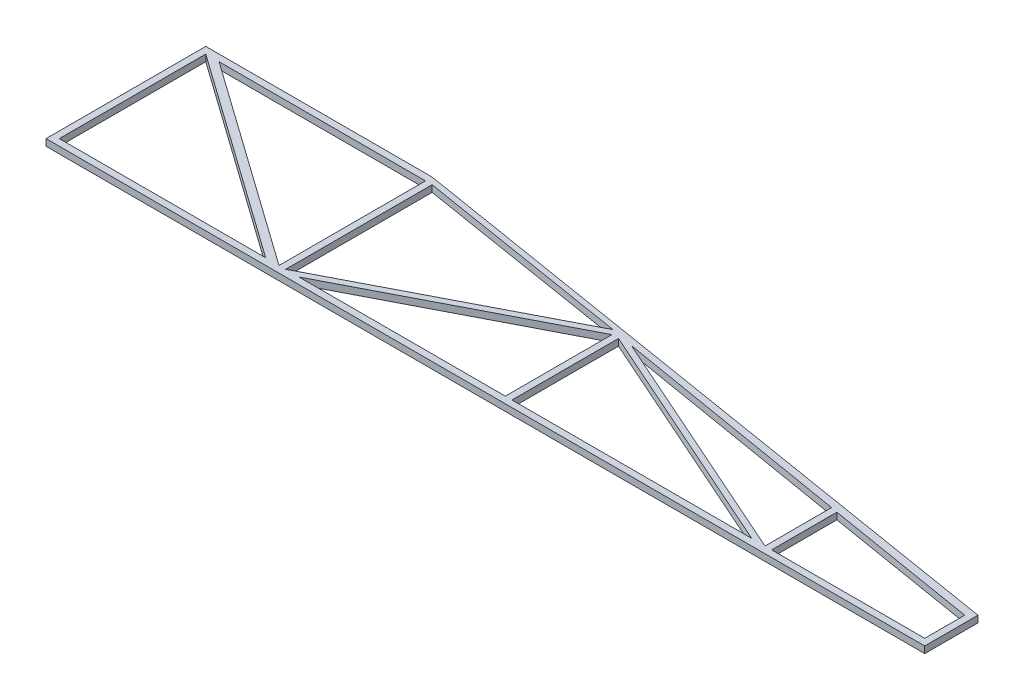
ISO-10303-21;
HEADER;
FILE_DESCRIPTION(('STEP AP214'),'2;1');
FILE_NAME('part.step','',(''),(''),'','','');
FILE_SCHEMA(('AUTOMOTIVE_DESIGN { 1 0 10303 214 1 1 1 1 }'));
ENDSEC;
DATA;
#1=APPLICATION_CONTEXT('core data for automotive mechanical design processes');
#2=APPLICATION_PROTOCOL_DEFINITION('international standard','automotive_design',2000,#1);
#3=PRODUCT_CONTEXT('',#1,'mechanical');
#4=PRODUCT('Part','Part','',(#3));
#5=PRODUCT_RELATED_PRODUCT_CATEGORY('part','',(#4));
#6=PRODUCT_DEFINITION_FORMATION('','',#4);
#7=PRODUCT_DEFINITION_CONTEXT('part definition',#1,'design');
#8=PRODUCT_DEFINITION('design','',#6,#7);
#9=PRODUCT_DEFINITION_SHAPE('','',#8);
#10=(LENGTH_UNIT() NAMED_UNIT(*) SI_UNIT(.MILLI.,.METRE.));
#11=(NAMED_UNIT(*) PLANE_ANGLE_UNIT() SI_UNIT($,.RADIAN.));
#12=(NAMED_UNIT(*) SI_UNIT($,.STERADIAN.) SOLID_ANGLE_UNIT());
#13=UNCERTAINTY_MEASURE_WITH_UNIT(LENGTH_MEASURE(1.E-05),#10,'distance_accuracy_value','');
#14=(GEOMETRIC_REPRESENTATION_CONTEXT(3) GLOBAL_UNCERTAINTY_ASSIGNED_CONTEXT((#13)) GLOBAL_UNIT_ASSIGNED_CONTEXT((#10,
#11,#12)) REPRESENTATION_CONTEXT('',''));
#15=CARTESIAN_POINT('',(0.,0.,0.));
#16=DIRECTION('',(0.,0.,1.));
#17=DIRECTION('',(1.,0.,0.));
#18=AXIS2_PLACEMENT_3D('',#15,#16,#17);
#19=CARTESIAN_POINT('',(0.,-6.35,0.));
#20=DIRECTION('',(0.,-1.,0.));
#21=DIRECTION('',(0.,0.,-1.));
#22=AXIS2_PLACEMENT_3D('',#19,#20,#21);
#23=PLANE('',#22);
#24=DIRECTION('',(-1.,0.,0.));
#25=VECTOR('',#24,1.);
#26=CARTESIAN_POINT('',(603.206446509024,-6.35,75.7404065649321));
#27=LINE('',#26,#25);
#28=CARTESIAN_POINT('',(749.256446509024,-6.35,75.7404065649321));
#29=VERTEX_POINT('',#28);
#30=CARTESIAN_POINT('',(603.206446509024,-6.35,75.7404065649321));
#31=VERTEX_POINT('',#30);
#32=EDGE_CURVE('E214',#29,#31,#27,.T.);
#33=ORIENTED_EDGE('',*,*,#32,.F.);
#34=DIRECTION('',(0.,0.,1.));
#35=VECTOR('',#34,1.);
#36=CARTESIAN_POINT('',(749.256446509024,-6.35,75.7404065649321));
#37=LINE('',#36,#35);
#38=CARTESIAN_POINT('',(749.256446509023,-6.35,37.6404065649321));
#39=VERTEX_POINT('',#38);
#40=EDGE_CURVE('E226',#39,#29,#37,.T.);
#41=ORIENTED_EDGE('',*,*,#40,.F.);
#42=DIRECTION('',(0.986624816923063,0.,0.163007578448159));
#43=VECTOR('',#42,1.);
#44=CARTESIAN_POINT('',(603.206446509024,-6.35,13.5104065649321));
#45=LINE('',#44,#43);
#46=CARTESIAN_POINT('',(603.206446509024,-6.35,13.5104065649321));
#47=VERTEX_POINT('',#46);
#48=EDGE_CURVE('E31',#47,#39,#45,.T.);
#49=ORIENTED_EDGE('',*,*,#48,.F.);
#50=DIRECTION('',(0.,0.,-1.));
#51=VECTOR('',#50,1.);
#52=CARTESIAN_POINT('',(603.206446509024,-6.35,75.7404065649321));
#53=LINE('',#52,#51);
#54=EDGE_CURVE('E207',#31,#47,#53,.T.);
#55=ORIENTED_EDGE('',*,*,#54,.F.);
#56=EDGE_LOOP('',(#33,#41,#49,#55));
#57=FACE_BOUND('',#56,.T.);
#58=DIRECTION('',(0.,0.,-1.));
#59=VECTOR('',#58,1.);
#60=CARTESIAN_POINT('',(133.306446509024,-6.35,75.7404065649321));
#61=LINE('',#60,#59);
#62=CARTESIAN_POINT('',(133.306446509024,-6.35,75.7404065649321));
#63=VERTEX_POINT('',#62);
#64=CARTESIAN_POINT('',(133.306446509024,-6.35,-63.9595934350679));
#65=VERTEX_POINT('',#64);
#66=EDGE_CURVE('E312',#63,#65,#61,.T.);
#67=ORIENTED_EDGE('',*,*,#66,.T.);
#68=DIRECTION('',(-1.,0.,0.));
#69=VECTOR('',#68,1.);
#70=CARTESIAN_POINT('',(133.306446509024,-6.35,-63.9595934350679));
#71=LINE('',#70,#69);
#72=CARTESIAN_POINT('',(-63.5435534909765,-6.35,-63.9595934350679));
#73=VERTEX_POINT('',#72);
#74=EDGE_CURVE('E307',#65,#73,#71,.T.);
#75=ORIENTED_EDGE('',*,*,#74,.T.);
#76=DIRECTION('',(0.815507144735217,0.,0.578747005941122));
#77=VECTOR('',#76,1.);
#78=CARTESIAN_POINT('',(-63.5435534909765,-6.35,-63.9595934350679));
#79=LINE('',#78,#77);
#80=EDGE_CURVE('E308',#73,#63,#79,.T.);
#81=ORIENTED_EDGE('',*,*,#80,.T.);
#82=EDGE_LOOP('',(#67,#75,#81));
#83=FACE_BOUND('',#82,.T.);
#84=DIRECTION('',(1.,0.,0.));
#85=VECTOR('',#84,1.);
#86=CARTESIAN_POINT('',(-82.5935534909764,-6.35,-70.3095934350679));
#87=LINE('',#86,#85);
#88=CARTESIAN_POINT('',(-82.5935534909764,-6.35,-70.3095934350679));
#89=VERTEX_POINT('',#88);
#90=CARTESIAN_POINT('',(131.246613350232,-6.35,-70.3095934350679));
#91=VERTEX_POINT('',#90);
#92=EDGE_CURVE('E346',#89,#91,#87,.T.);
#93=ORIENTED_EDGE('',*,*,#92,.T.);
#94=CARTESIAN_POINT('',(131.246613350232,-6.35,-44.9095934350679));
#95=DIRECTION('',(0.,-1.,0.));
#96=DIRECTION('',(0.,0.,-1.));
#97=AXIS2_PLACEMENT_3D('',#94,#95,#96);
#98=CIRCLE('',#97,25.4);
#99=CARTESIAN_POINT('',(135.339363582347,-6.35,-69.9776886067702));
#100=VERTEX_POINT('',#99);
#101=EDGE_CURVE('E393',#91,#100,#98,.T.);
#102=ORIENTED_EDGE('',*,*,#101,.T.);
#103=DIRECTION('',(0.986932880775682,0.,0.161131898902152));
#104=VECTOR('',#103,1.);
#105=CARTESIAN_POINT('',(133.306446509024,-6.35,-70.3095934350679));
#106=LINE('',#105,#104);
#107=CARTESIAN_POINT('',(755.606446509024,-6.35,31.2904065649321));
#108=VERTEX_POINT('',#107);
#109=EDGE_CURVE('E349',#100,#108,#106,.T.);
#110=ORIENTED_EDGE('',*,*,#109,.T.);
#111=DIRECTION('',(0.,0.,1.));
#112=VECTOR('',#111,1.);
#113=CARTESIAN_POINT('',(755.606446509023,-6.35,82.0904065649321));
#114=LINE('',#113,#112);
#115=CARTESIAN_POINT('',(755.606446509023,-6.35,82.0904065649321));
#116=VERTEX_POINT('',#115);
#117=EDGE_CURVE('E352',#108,#116,#114,.T.);
#118=ORIENTED_EDGE('',*,*,#117,.T.);
#119=DIRECTION('',(-1.,0.,0.));
#120=VECTOR('',#119,1.);
#121=CARTESIAN_POINT('',(-82.5935534909764,-6.35,82.0904065649321));
#122=LINE('',#121,#120);
#123=CARTESIAN_POINT('',(-82.5935534909764,-6.35,82.0904065649321));
#124=VERTEX_POINT('',#123);
#125=EDGE_CURVE('E354',#116,#124,#122,.T.);
#126=ORIENTED_EDGE('',*,*,#125,.T.);
#127=DIRECTION('',(0.,0.,-1.));
#128=VECTOR('',#127,1.);
#129=CARTESIAN_POINT('',(-82.5935534909764,-6.35,82.0904065649321));
#130=LINE('',#129,#128);
#131=EDGE_CURVE('E350',#124,#89,#130,.T.);
#132=ORIENTED_EDGE('',*,*,#131,.T.);
#133=EDGE_LOOP('',(#93,#102,#110,#118,#126,#132));
#134=FACE_BOUND('',#133,.T.);
#135=DIRECTION('',(0.,0.,1.));
#136=VECTOR('',#135,1.);
#137=CARTESIAN_POINT('',(-76.2435534909764,-6.35,75.7404065649321));
#138=LINE('',#137,#136);
#139=CARTESIAN_POINT('',(-76.2435534909764,-6.35,-63.9595934350679));
#140=VERTEX_POINT('',#139);
#141=CARTESIAN_POINT('',(-76.2435534909764,-6.35,75.7404065649321));
#142=VERTEX_POINT('',#141);
#143=EDGE_CURVE('E331',#140,#142,#138,.T.);
#144=ORIENTED_EDGE('',*,*,#143,.T.);
#145=DIRECTION('',(1.,0.,0.));
#146=VECTOR('',#145,1.);
#147=CARTESIAN_POINT('',(-76.2435534909764,-6.35,75.7404065649321));
#148=LINE('',#147,#146);
#149=CARTESIAN_POINT('',(120.606446509024,-6.35,75.7404065649321));
#150=VERTEX_POINT('',#149);
#151=EDGE_CURVE('E326',#142,#150,#148,.T.);
#152=ORIENTED_EDGE('',*,*,#151,.T.);
#153=DIRECTION('',(-0.815507144735217,0.,-0.578747005941122));
#154=VECTOR('',#153,1.);
#155=CARTESIAN_POINT('',(120.606446509024,-6.35,75.7404065649321));
#156=LINE('',#155,#154);
#157=EDGE_CURVE('E327',#150,#140,#156,.T.);
#158=ORIENTED_EDGE('',*,*,#157,.T.);
#159=EDGE_LOOP('',(#144,#152,#158));
#160=FACE_BOUND('',#159,.T.);
#161=DIRECTION('',(-0.888617232654949,0.,0.458649554484314));
#162=VECTOR('',#161,1.);
#163=CARTESIAN_POINT('',(139.656446509024,-6.35,75.7404065649321));
#164=LINE('',#163,#162);
#165=CARTESIAN_POINT('',(345.615705607624,-6.35,-30.5630939256699));
#166=VERTEX_POINT('',#165);
#167=CARTESIAN_POINT('',(139.656446509024,-6.35,75.7404065649321));
#168=VERTEX_POINT('',#167);
#169=EDGE_CURVE('E289',#166,#168,#164,.T.);
#170=ORIENTED_EDGE('',*,*,#169,.F.);
#171=DIRECTION('',(0.987107218888045,0.,0.160060421151232));
#172=VECTOR('',#171,1.);
#173=CARTESIAN_POINT('',(139.656446509024,-6.35,-63.9595934350679));
#174=LINE('',#173,#172);
#175=CARTESIAN_POINT('',(139.656446509024,-6.35,-63.9595934350679));
#176=VERTEX_POINT('',#175);
#177=EDGE_CURVE('E293',#176,#166,#174,.T.);
#178=ORIENTED_EDGE('',*,*,#177,.F.);
#179=DIRECTION('',(0.,0.,-1.));
#180=VECTOR('',#179,1.);
#181=CARTESIAN_POINT('',(139.656446509024,-6.35,75.7404065649321));
#182=LINE('',#181,#180);
#183=EDGE_CURVE('E290',#168,#176,#182,.T.);
#184=ORIENTED_EDGE('',*,*,#183,.F.);
#185=EDGE_LOOP('',(#170,#178,#184));
#186=FACE_BOUND('',#185,.T.);
#187=DIRECTION('',(0.,0.,1.));
#188=VECTOR('',#187,1.);
#189=CARTESIAN_POINT('',(349.206446509024,-6.35,75.7404065649321));
#190=LINE('',#189,#188);
#191=CARTESIAN_POINT('',(349.206446509024,-6.35,-25.8595934350679));
#192=VERTEX_POINT('',#191);
#193=CARTESIAN_POINT('',(349.206446509024,-6.35,75.7404065649321));
#194=VERTEX_POINT('',#193);
#195=EDGE_CURVE('E271',#192,#194,#190,.T.);
#196=ORIENTED_EDGE('',*,*,#195,.F.);
#197=DIRECTION('',(0.888620657054864,0.,-0.458642919770252));
#198=VECTOR('',#197,1.);
#199=CARTESIAN_POINT('',(152.356446509024,-6.35,75.7404065649321));
#200=LINE('',#199,#198);
#201=CARTESIAN_POINT('',(152.356446509024,-6.35,75.7404065649321));
#202=VERTEX_POINT('',#201);
#203=EDGE_CURVE('E275',#202,#192,#200,.T.);
#204=ORIENTED_EDGE('',*,*,#203,.F.);
#205=DIRECTION('',(-1.,0.,0.));
#206=VECTOR('',#205,1.);
#207=CARTESIAN_POINT('',(349.206446509024,-6.35,75.7404065649321));
#208=LINE('',#207,#206);
#209=EDGE_CURVE('E272',#194,#202,#208,.T.);
#210=ORIENTED_EDGE('',*,*,#209,.F.);
#211=EDGE_LOOP('',(#196,#204,#210));
#212=FACE_BOUND('',#211,.T.);
#213=DIRECTION('',(0.,0.,1.));
#214=VECTOR('',#213,1.);
#215=CARTESIAN_POINT('',(596.856446509024,-6.35,75.7404065649321));
#216=LINE('',#215,#214);
#217=CARTESIAN_POINT('',(596.856446509024,-6.35,12.2520352918808));
#218=VERTEX_POINT('',#217);
#219=CARTESIAN_POINT('',(596.856446509024,-6.35,75.7404065649321));
#220=VERTEX_POINT('',#219);
#221=EDGE_CURVE('E253',#218,#220,#216,.T.);
#222=ORIENTED_EDGE('',*,*,#221,.F.);
#223=DIRECTION('',(0.986275407418878,0.,0.165108511957215));
#224=VECTOR('',#223,1.);
#225=CARTESIAN_POINT('',(367.645239742049,-6.35,-26.1193171605279));
#226=LINE('',#225,#224);
#227=CARTESIAN_POINT('',(367.645239742049,-6.35,-26.1193171605279));
#228=VERTEX_POINT('',#227);
#229=EDGE_CURVE('E257',#228,#218,#226,.T.);
#230=ORIENTED_EDGE('',*,*,#229,.F.);
#231=DIRECTION('',(-0.913829190738463,0.,-0.406098768964258));
#232=VECTOR('',#231,1.);
#233=CARTESIAN_POINT('',(596.856446509024,-6.35,75.7404065649321));
#234=LINE('',#233,#232);
#235=EDGE_CURVE('E254',#220,#228,#234,.T.);
#236=ORIENTED_EDGE('',*,*,#235,.F.);
#237=EDGE_LOOP('',(#222,#230,#236));
#238=FACE_BOUND('',#237,.T.);
#239=DIRECTION('',(0.,0.,1.));
#240=VECTOR('',#239,1.);
#241=CARTESIAN_POINT('',(355.556446509024,-6.35,75.7404065649321));
#242=LINE('',#241,#240);
#243=CARTESIAN_POINT('',(355.556446509024,-6.35,-25.859593435068));
#244=VERTEX_POINT('',#243);
#245=CARTESIAN_POINT('',(355.556446509024,-6.35,75.7404065649321));
#246=VERTEX_POINT('',#245);
#247=EDGE_CURVE('E239',#244,#246,#242,.T.);
#248=ORIENTED_EDGE('',*,*,#247,.T.);
#249=DIRECTION('',(1.,0.,0.));
#250=VECTOR('',#249,1.);
#251=CARTESIAN_POINT('',(355.556446509024,-6.35,75.7404065649321));
#252=LINE('',#251,#250);
#253=CARTESIAN_POINT('',(584.156446509024,-6.35,75.7404065649321));
#254=VERTEX_POINT('',#253);
#255=EDGE_CURVE('E210',#246,#254,#252,.T.);
#256=ORIENTED_EDGE('',*,*,#255,.T.);
#257=DIRECTION('',(-0.913811548620257,0.,-0.406138466053448));
#258=VECTOR('',#257,1.);
#259=CARTESIAN_POINT('',(584.156446509024,-6.35,75.7404065649321));
#260=LINE('',#259,#258);
#261=EDGE_CURVE('E235',#254,#244,#260,.T.);
#262=ORIENTED_EDGE('',*,*,#261,.T.);
#263=EDGE_LOOP('',(#248,#256,#262));
#264=FACE_BOUND('',#263,.T.);
#265=ADVANCED_FACE('F16',(#57,#83,#134,#160,#186,#212,#238,#264),#23,.T.);
#266=CARTESIAN_POINT('',(0.,0.,0.));
#267=DIRECTION('',(0.,-1.,0.));
#268=DIRECTION('',(0.,0.,-1.));
#269=AXIS2_PLACEMENT_3D('',#266,#267,#268);
#270=PLANE('',#269);
#271=DIRECTION('',(0.,0.,1.));
#272=VECTOR('',#271,1.);
#273=CARTESIAN_POINT('',(749.256446509023,0.,-2.18331170147807E-12));
#274=LINE('',#273,#272);
#275=CARTESIAN_POINT('',(749.256446509023,0.,37.6404065649321));
#276=VERTEX_POINT('',#275);
#277=CARTESIAN_POINT('',(749.256446509024,0.,75.7404065649321));
#278=VERTEX_POINT('',#277);
#279=EDGE_CURVE('E443',#276,#278,#274,.T.);
#280=ORIENTED_EDGE('',*,*,#279,.T.);
#281=DIRECTION('',(-1.,0.,0.));
#282=VECTOR('',#281,1.);
#283=CARTESIAN_POINT('',(0.,0.,75.740406564932));
#284=LINE('',#283,#282);
#285=CARTESIAN_POINT('',(603.206446509024,0.,75.7404065649321));
#286=VERTEX_POINT('',#285);
#287=EDGE_CURVE('E10',#278,#286,#284,.T.);
#288=ORIENTED_EDGE('',*,*,#287,.T.);
#289=DIRECTION('',(0.,0.,-1.));
#290=VECTOR('',#289,1.);
#291=CARTESIAN_POINT('',(603.206446509024,0.,0.));
#292=LINE('',#291,#290);
#293=CARTESIAN_POINT('',(603.206446509024,0.,13.5104065649321));
#294=VERTEX_POINT('',#293);
#295=EDGE_CURVE('E24',#286,#294,#292,.T.);
#296=ORIENTED_EDGE('',*,*,#295,.T.);
#297=DIRECTION('',(0.986624816923063,0.,0.163007578448159));
#298=VECTOR('',#297,1.);
#299=CARTESIAN_POINT('',(13.8552398679068,0.,-83.8606623583831));
#300=LINE('',#299,#298);
#301=EDGE_CURVE('E446',#294,#276,#300,.T.);
#302=ORIENTED_EDGE('',*,*,#301,.T.);
#303=EDGE_LOOP('',(#280,#288,#296,#302));
#304=FACE_BOUND('',#303,.T.);
#305=DIRECTION('',(-1.,0.,0.));
#306=VECTOR('',#305,1.);
#307=CARTESIAN_POINT('',(0.,0.,-63.9595934350679));
#308=LINE('',#307,#306);
#309=CARTESIAN_POINT('',(133.306446509024,0.,-63.9595934350679));
#310=VERTEX_POINT('',#309);
#311=CARTESIAN_POINT('',(-63.5435534909765,0.,-63.9595934350679));
#312=VERTEX_POINT('',#311);
#313=EDGE_CURVE('E407',#310,#312,#308,.T.);
#314=ORIENTED_EDGE('',*,*,#313,.F.);
#315=DIRECTION('',(0.,0.,-1.));
#316=VECTOR('',#315,1.);
#317=CARTESIAN_POINT('',(133.306446509024,0.,0.));
#318=LINE('',#317,#316);
#319=CARTESIAN_POINT('',(133.306446509024,0.,75.7404065649321));
#320=VERTEX_POINT('',#319);
#321=EDGE_CURVE('E402',#320,#310,#318,.T.);
#322=ORIENTED_EDGE('',*,*,#321,.F.);
#323=DIRECTION('',(0.815507144735218,0.,0.578747005941122));
#324=VECTOR('',#323,1.);
#325=CARTESIAN_POINT('',(8.90336528241088,0.,-12.5456510797608));
#326=LINE('',#325,#324);
#327=EDGE_CURVE('E404',#312,#320,#326,.T.);
#328=ORIENTED_EDGE('',*,*,#327,.F.);
#329=EDGE_LOOP('',(#314,#322,#328));
#330=FACE_BOUND('',#329,.T.);
#331=DIRECTION('',(0.986932880775682,0.,0.161131898902152));
#332=VECTOR('',#331,1.);
#333=CARTESIAN_POINT('',(133.306446509024,0.,-70.3095934350679));
#334=LINE('',#333,#332);
#335=CARTESIAN_POINT('',(135.339363582347,0.,-69.9776886067702));
#336=VERTEX_POINT('',#335);
#337=CARTESIAN_POINT('',(755.606446509024,0.,31.2904065649321));
#338=VERTEX_POINT('',#337);
#339=EDGE_CURVE('E364',#336,#338,#334,.T.);
#340=ORIENTED_EDGE('',*,*,#339,.F.);
#341=CARTESIAN_POINT('',(131.246613350232,0.,-44.9095934350679));
#342=DIRECTION('',(0.,-1.,0.));
#343=DIRECTION('',(0.,0.,-1.));
#344=AXIS2_PLACEMENT_3D('',#341,#342,#343);
#345=CIRCLE('',#344,25.4);
#346=CARTESIAN_POINT('',(131.246613350232,0.,-70.3095934350679));
#347=VERTEX_POINT('',#346);
#348=EDGE_CURVE('E389',#336,#347,#345,.F.);
#349=ORIENTED_EDGE('',*,*,#348,.T.);
#350=DIRECTION('',(1.,0.,0.));
#351=VECTOR('',#350,1.);
#352=CARTESIAN_POINT('',(-82.5935534909764,0.,-70.3095934350679));
#353=LINE('',#352,#351);
#354=CARTESIAN_POINT('',(-82.5935534909764,0.,-70.3095934350679));
#355=VERTEX_POINT('',#354);
#356=EDGE_CURVE('E360',#355,#347,#353,.T.);
#357=ORIENTED_EDGE('',*,*,#356,.F.);
#358=DIRECTION('',(0.,0.,-1.));
#359=VECTOR('',#358,1.);
#360=CARTESIAN_POINT('',(-82.5935534909764,0.,82.0904065649321));
#361=LINE('',#360,#359);
#362=CARTESIAN_POINT('',(-82.5935534909764,0.,82.0904065649321));
#363=VERTEX_POINT('',#362);
#364=EDGE_CURVE('E345',#363,#355,#361,.T.);
#365=ORIENTED_EDGE('',*,*,#364,.F.);
#366=DIRECTION('',(-1.,0.,0.));
#367=VECTOR('',#366,1.);
#368=CARTESIAN_POINT('',(-82.5935534909764,0.,82.0904065649321));
#369=LINE('',#368,#367);
#370=CARTESIAN_POINT('',(755.606446509023,0.,82.0904065649321));
#371=VERTEX_POINT('',#370);
#372=EDGE_CURVE('E359',#371,#363,#369,.T.);
#373=ORIENTED_EDGE('',*,*,#372,.F.);
#374=DIRECTION('',(0.,0.,1.));
#375=VECTOR('',#374,1.);
#376=CARTESIAN_POINT('',(755.606446509023,0.,82.0904065649321));
#377=LINE('',#376,#375);
#378=EDGE_CURVE('E367',#338,#371,#377,.T.);
#379=ORIENTED_EDGE('',*,*,#378,.F.);
#380=EDGE_LOOP('',(#340,#349,#357,#365,#373,#379));
#381=FACE_BOUND('',#380,.T.);
#382=DIRECTION('',(1.,0.,0.));
#383=VECTOR('',#382,1.);
#384=CARTESIAN_POINT('',(0.,0.,75.7404065649321));
#385=LINE('',#384,#383);
#386=CARTESIAN_POINT('',(-76.2435534909764,0.,75.7404065649321));
#387=VERTEX_POINT('',#386);
#388=CARTESIAN_POINT('',(120.606446509024,0.,75.7404065649321));
#389=VERTEX_POINT('',#388);
#390=EDGE_CURVE('E400',#387,#389,#385,.T.);
#391=ORIENTED_EDGE('',*,*,#390,.F.);
#392=DIRECTION('',(0.,0.,1.));
#393=VECTOR('',#392,1.);
#394=CARTESIAN_POINT('',(-76.2435534909764,0.,0.));
#395=LINE('',#394,#393);
#396=CARTESIAN_POINT('',(-76.2435534909764,0.,-63.9595934350679));
#397=VERTEX_POINT('',#396);
#398=EDGE_CURVE('E395',#397,#387,#395,.T.);
#399=ORIENTED_EDGE('',*,*,#398,.F.);
#400=DIRECTION('',(-0.815507144735218,0.,-0.578747005941122));
#401=VECTOR('',#400,1.);
#402=CARTESIAN_POINT('',(4.64952445196105,0.,-6.55160263685421));
#403=LINE('',#402,#401);
#404=EDGE_CURVE('E397',#389,#397,#403,.T.);
#405=ORIENTED_EDGE('',*,*,#404,.F.);
#406=EDGE_LOOP('',(#391,#399,#405));
#407=FACE_BOUND('',#406,.T.);
#408=DIRECTION('',(0.987107218888045,0.,0.160060421151232));
#409=VECTOR('',#408,1.);
#410=CARTESIAN_POINT('',(13.6833166769859,0.,-84.386262219203));
#411=LINE('',#410,#409);
#412=CARTESIAN_POINT('',(139.656446509024,0.,-63.9595934350679));
#413=VERTEX_POINT('',#412);
#414=CARTESIAN_POINT('',(345.615705607624,0.,-30.5630939256699));
#415=VERTEX_POINT('',#414);
#416=EDGE_CURVE('E409',#413,#415,#411,.T.);
#417=ORIENTED_EDGE('',*,*,#416,.T.);
#418=DIRECTION('',(-0.888617232654949,0.,0.458649554484314));
#419=VECTOR('',#418,1.);
#420=CARTESIAN_POINT('',(60.2471035504606,0.,116.72662473788));
#421=LINE('',#420,#419);
#422=CARTESIAN_POINT('',(139.656446509024,0.,75.7404065649321));
#423=VERTEX_POINT('',#422);
#424=EDGE_CURVE('E415',#415,#423,#421,.T.);
#425=ORIENTED_EDGE('',*,*,#424,.T.);
#426=DIRECTION('',(0.,0.,-1.));
#427=VECTOR('',#426,1.);
#428=CARTESIAN_POINT('',(139.656446509024,0.,0.));
#429=LINE('',#428,#427);
#430=EDGE_CURVE('E412',#423,#413,#429,.T.);
#431=ORIENTED_EDGE('',*,*,#430,.T.);
#432=EDGE_LOOP('',(#417,#425,#431));
#433=FACE_BOUND('',#432,.T.);
#434=DIRECTION('',(0.888620657054864,0.,-0.458642919770252));
#435=VECTOR('',#434,1.);
#436=CARTESIAN_POINT('',(62.9174132806214,0.,121.902488231204));
#437=LINE('',#436,#435);
#438=CARTESIAN_POINT('',(152.356446509024,0.,75.7404065649321));
#439=VERTEX_POINT('',#438);
#440=CARTESIAN_POINT('',(349.206446509024,0.,-25.8595934350679));
#441=VERTEX_POINT('',#440);
#442=EDGE_CURVE('E418',#439,#441,#437,.T.);
#443=ORIENTED_EDGE('',*,*,#442,.T.);
#444=DIRECTION('',(0.,0.,1.));
#445=VECTOR('',#444,1.);
#446=CARTESIAN_POINT('',(349.206446509024,0.,0.));
#447=LINE('',#446,#445);
#448=CARTESIAN_POINT('',(349.206446509024,0.,75.7404065649321));
#449=VERTEX_POINT('',#448);
#450=EDGE_CURVE('E424',#441,#449,#447,.T.);
#451=ORIENTED_EDGE('',*,*,#450,.T.);
#452=DIRECTION('',(-1.,0.,0.));
#453=VECTOR('',#452,1.);
#454=CARTESIAN_POINT('',(0.,0.,75.740406564932));
#455=LINE('',#454,#453);
#456=EDGE_CURVE('E421',#449,#439,#455,.T.);
#457=ORIENTED_EDGE('',*,*,#456,.T.);
#458=EDGE_LOOP('',(#443,#451,#457));
#459=FACE_BOUND('',#458,.T.);
#460=DIRECTION('',(0.986275407418878,0.,0.165108511957215));
#461=VECTOR('',#460,1.);
#462=CARTESIAN_POINT('',(14.2756449573335,0.,-85.2755401860192));
#463=LINE('',#462,#461);
#464=CARTESIAN_POINT('',(367.645239742049,0.,-26.1193171605279));
#465=VERTEX_POINT('',#464);
#466=CARTESIAN_POINT('',(596.856446509024,0.,12.2520352918808));
#467=VERTEX_POINT('',#466);
#468=EDGE_CURVE('E427',#465,#467,#463,.T.);
#469=ORIENTED_EDGE('',*,*,#468,.T.);
#470=DIRECTION('',(0.,0.,1.));
#471=VECTOR('',#470,1.);
#472=CARTESIAN_POINT('',(596.856446509024,0.,0.));
#473=LINE('',#472,#471);
#474=CARTESIAN_POINT('',(596.856446509024,0.,75.7404065649321));
#475=VERTEX_POINT('',#474);
#476=EDGE_CURVE('E433',#467,#475,#473,.T.);
#477=ORIENTED_EDGE('',*,*,#476,.T.);
#478=DIRECTION('',(-0.913829190738463,0.,-0.406098768964258));
#479=VECTOR('',#478,1.);
#480=CARTESIAN_POINT('',(70.3236664480353,0.,-158.246771749327));
#481=LINE('',#480,#479);
#482=EDGE_CURVE('E430',#475,#465,#481,.T.);
#483=ORIENTED_EDGE('',*,*,#482,.T.);
#484=EDGE_LOOP('',(#469,#477,#483));
#485=FACE_BOUND('',#484,.T.);
#486=DIRECTION('',(1.,0.,0.));
#487=VECTOR('',#486,1.);
#488=CARTESIAN_POINT('',(0.,0.,75.740406564932));
#489=LINE('',#488,#487);
#490=CARTESIAN_POINT('',(355.556446509024,0.,75.7404065649321));
#491=VERTEX_POINT('',#490);
#492=CARTESIAN_POINT('',(584.156446509024,0.,75.7404065649321));
#493=VERTEX_POINT('',#492);
#494=EDGE_CURVE('E441',#491,#493,#489,.T.);
#495=ORIENTED_EDGE('',*,*,#494,.F.);
#496=DIRECTION('',(0.,0.,1.));
#497=VECTOR('',#496,1.);
#498=CARTESIAN_POINT('',(355.556446509024,0.,0.));
#499=LINE('',#498,#497);
#500=CARTESIAN_POINT('',(355.556446509024,0.,-25.859593435068));
#501=VERTEX_POINT('',#500);
#502=EDGE_CURVE('E436',#501,#491,#499,.T.);
#503=ORIENTED_EDGE('',*,*,#502,.F.);
#504=DIRECTION('',(-0.913811548620257,0.,-0.406138466053448));
#505=VECTOR('',#504,1.);
#506=CARTESIAN_POINT('',(68.245860905225,0.,-153.553187036756));
#507=LINE('',#506,#505);
#508=EDGE_CURVE('E438',#493,#501,#507,.T.);
#509=ORIENTED_EDGE('',*,*,#508,.F.);
#510=EDGE_LOOP('',(#495,#503,#509));
#511=FACE_BOUND('',#510,.T.);
#512=ADVANCED_FACE('F449',(#304,#330,#381,#407,#433,#459,#485,#511),#270,.F.);
#513=CARTESIAN_POINT('',(-82.5935534909764,-6.35,82.0904065649321));
#514=DIRECTION('',(1.,0.,0.));
#515=DIRECTION('',(0.,0.,-1.));
#516=AXIS2_PLACEMENT_3D('',#513,#514,#515);
#517=PLANE('',#516);
#518=ORIENTED_EDGE('',*,*,#364,.T.);
#519=DIRECTION('',(0.,1.,0.));
#520=VECTOR('',#519,1.);
#521=CARTESIAN_POINT('',(-82.5935534909764,-6.35,-70.3095934350679));
#522=LINE('',#521,#520);
#523=EDGE_CURVE('E383',#89,#355,#522,.T.);
#524=ORIENTED_EDGE('',*,*,#523,.F.);
#525=ORIENTED_EDGE('',*,*,#131,.F.);
#526=DIRECTION('',(0.,1.,0.));
#527=VECTOR('',#526,1.);
#528=CARTESIAN_POINT('',(-82.5935534909764,-6.35,82.0904065649321));
#529=LINE('',#528,#527);
#530=EDGE_CURVE('E356',#124,#363,#529,.T.);
#531=ORIENTED_EDGE('',*,*,#530,.T.);
#532=EDGE_LOOP('',(#518,#524,#525,#531));
#533=FACE_BOUND('',#532,.T.);
#534=ADVANCED_FACE('F467',(#533),#517,.F.);
#535=CARTESIAN_POINT('',(-82.5935534909764,-6.35,-70.3095934350679));
#536=DIRECTION('',(0.,0.,1.));
#537=DIRECTION('',(1.,0.,0.));
#538=AXIS2_PLACEMENT_3D('',#535,#536,#537);
#539=PLANE('',#538);
#540=ORIENTED_EDGE('',*,*,#356,.T.);
#541=DIRECTION('',(0.,1.,0.));
#542=VECTOR('',#541,1.);
#543=CARTESIAN_POINT('',(131.246613350232,-6.35,-70.3095934350679));
#544=LINE('',#543,#542);
#545=EDGE_CURVE('E391',#347,#91,#544,.F.);
#546=ORIENTED_EDGE('',*,*,#545,.T.);
#547=ORIENTED_EDGE('',*,*,#92,.F.);
#548=ORIENTED_EDGE('',*,*,#523,.T.);
#549=EDGE_LOOP('',(#540,#546,#547,#548));
#550=FACE_BOUND('',#549,.T.);
#551=ADVANCED_FACE('F484',(#550),#539,.F.);
#552=CARTESIAN_POINT('',(133.306446509024,-6.35,-70.3095934350679));
#553=DIRECTION('',(-0.161131898902152,0.,0.986932880775682));
#554=DIRECTION('',(0.986932880775682,0.,0.161131898902152));
#555=AXIS2_PLACEMENT_3D('',#552,#553,#554);
#556=PLANE('',#555);
#557=ORIENTED_EDGE('',*,*,#109,.F.);
#558=DIRECTION('',(0.,1.,0.));
#559=VECTOR('',#558,1.);
#560=CARTESIAN_POINT('',(135.339363582347,-6.35,-69.9776886067702));
#561=LINE('',#560,#559);
#562=EDGE_CURVE('E386',#100,#336,#561,.T.);
#563=ORIENTED_EDGE('',*,*,#562,.T.);
#564=ORIENTED_EDGE('',*,*,#339,.T.);
#565=DIRECTION('',(0.,1.,0.));
#566=VECTOR('',#565,1.);
#567=CARTESIAN_POINT('',(755.606446509024,-6.35,31.2904065649321));
#568=LINE('',#567,#566);
#569=EDGE_CURVE('E380',#108,#338,#568,.T.);
#570=ORIENTED_EDGE('',*,*,#569,.F.);
#571=EDGE_LOOP('',(#557,#563,#564,#570));
#572=FACE_BOUND('',#571,.T.);
#573=ADVANCED_FACE('F480',(#572),#556,.F.);
#574=CARTESIAN_POINT('',(755.606446509023,-6.35,82.0904065649321));
#575=DIRECTION('',(-1.,0.,0.));
#576=DIRECTION('',(0.,0.,1.));
#577=AXIS2_PLACEMENT_3D('',#574,#575,#576);
#578=PLANE('',#577);
#579=ORIENTED_EDGE('',*,*,#378,.T.);
#580=DIRECTION('',(0.,1.,0.));
#581=VECTOR('',#580,1.);
#582=CARTESIAN_POINT('',(755.606446509023,-6.35,82.0904065649321));
#583=LINE('',#582,#581);
#584=EDGE_CURVE('E377',#116,#371,#583,.T.);
#585=ORIENTED_EDGE('',*,*,#584,.F.);
#586=ORIENTED_EDGE('',*,*,#117,.F.);
#587=ORIENTED_EDGE('',*,*,#569,.T.);
#588=EDGE_LOOP('',(#579,#585,#586,#587));
#589=FACE_BOUND('',#588,.T.);
#590=ADVANCED_FACE('F476',(#589),#578,.F.);
#591=CARTESIAN_POINT('',(-82.5935534909764,-6.35,82.0904065649321));
#592=DIRECTION('',(0.,0.,-1.));
#593=DIRECTION('',(-1.,0.,0.));
#594=AXIS2_PLACEMENT_3D('',#591,#592,#593);
#595=PLANE('',#594);
#596=ORIENTED_EDGE('',*,*,#372,.T.);
#597=ORIENTED_EDGE('',*,*,#530,.F.);
#598=ORIENTED_EDGE('',*,*,#125,.F.);
#599=ORIENTED_EDGE('',*,*,#584,.T.);
#600=EDGE_LOOP('',(#596,#597,#598,#599));
#601=FACE_BOUND('',#600,.T.);
#602=ADVANCED_FACE('F473',(#601),#595,.F.);
#603=CARTESIAN_POINT('',(131.246613350232,-6.35,-44.9095934350679));
#604=DIRECTION('',(0.,1.,0.));
#605=DIRECTION('',(0.,0.,1.));
#606=AXIS2_PLACEMENT_3D('',#603,#604,#605);
#607=CYLINDRICAL_SURFACE('',#606,25.4);
#608=ORIENTED_EDGE('',*,*,#101,.F.);
#609=ORIENTED_EDGE('',*,*,#545,.F.);
#610=ORIENTED_EDGE('',*,*,#348,.F.);
#611=ORIENTED_EDGE('',*,*,#562,.F.);
#612=EDGE_LOOP('',(#608,#609,#610,#611));
#613=FACE_BOUND('',#612,.T.);
#614=ADVANCED_FACE('F18',(#613),#607,.T.);
#615=CARTESIAN_POINT('',(-76.2435534909764,1680.80970402121,75.7404065649321));
#616=DIRECTION('',(0.,0.,-1.));
#617=DIRECTION('',(-1.,0.,0.));
#618=AXIS2_PLACEMENT_3D('',#615,#616,#617);
#619=PLANE('',#618);
#620=ORIENTED_EDGE('',*,*,#390,.T.);
#621=DIRECTION('',(0.,-1.,0.));
#622=VECTOR('',#621,1.);
#623=CARTESIAN_POINT('',(120.606446509024,1680.80970402121,75.7404065649321));
#624=LINE('',#623,#622);
#625=EDGE_CURVE('E343',#389,#150,#624,.T.);
#626=ORIENTED_EDGE('',*,*,#625,.T.);
#627=ORIENTED_EDGE('',*,*,#151,.F.);
#628=DIRECTION('',(0.,-1.,0.));
#629=VECTOR('',#628,1.);
#630=CARTESIAN_POINT('',(-76.2435534909764,1680.80970402121,75.7404065649321));
#631=LINE('',#630,#629);
#632=EDGE_CURVE('E335',#387,#142,#631,.T.);
#633=ORIENTED_EDGE('',*,*,#632,.F.);
#634=EDGE_LOOP('',(#620,#626,#627,#633));
#635=FACE_BOUND('',#634,.T.);
#636=ADVANCED_FACE('F470',(#635),#619,.T.);
#637=CARTESIAN_POINT('',(120.606446509024,1680.80970402121,75.7404065649321));
#638=DIRECTION('',(-0.578747005941122,0.,0.815507144735217));
#639=DIRECTION('',(0.815507144735218,0.,0.578747005941122));
#640=AXIS2_PLACEMENT_3D('',#637,#638,#639);
#641=PLANE('',#640);
#642=ORIENTED_EDGE('',*,*,#404,.T.);
#643=DIRECTION('',(0.,-1.,0.));
#644=VECTOR('',#643,1.);
#645=CARTESIAN_POINT('',(-76.2435534909764,1680.80970402121,-63.9595934350679));
#646=LINE('',#645,#644);
#647=EDGE_CURVE('E341',#397,#140,#646,.T.);
#648=ORIENTED_EDGE('',*,*,#647,.T.);
#649=ORIENTED_EDGE('',*,*,#157,.F.);
#650=ORIENTED_EDGE('',*,*,#625,.F.);
#651=EDGE_LOOP('',(#642,#648,#649,#650));
#652=FACE_BOUND('',#651,.T.);
#653=ADVANCED_FACE('F516',(#652),#641,.T.);
#654=CARTESIAN_POINT('',(-76.2435534909764,1680.80970402121,75.7404065649321));
#655=DIRECTION('',(1.,0.,0.));
#656=DIRECTION('',(0.,0.,-1.));
#657=AXIS2_PLACEMENT_3D('',#654,#655,#656);
#658=PLANE('',#657);
#659=ORIENTED_EDGE('',*,*,#398,.T.);
#660=ORIENTED_EDGE('',*,*,#632,.T.);
#661=ORIENTED_EDGE('',*,*,#143,.F.);
#662=ORIENTED_EDGE('',*,*,#647,.F.);
#663=EDGE_LOOP('',(#659,#660,#661,#662));
#664=FACE_BOUND('',#663,.T.);
#665=ADVANCED_FACE('F521',(#664),#658,.T.);
#666=CARTESIAN_POINT('',(133.306446509024,1680.80970402121,-63.9595934350679));
#667=DIRECTION('',(0.,0.,1.));
#668=DIRECTION('',(1.,0.,0.));
#669=AXIS2_PLACEMENT_3D('',#666,#667,#668);
#670=PLANE('',#669);
#671=ORIENTED_EDGE('',*,*,#313,.T.);
#672=DIRECTION('',(0.,-1.,0.));
#673=VECTOR('',#672,1.);
#674=CARTESIAN_POINT('',(-63.5435534909765,1680.80970402121,-63.9595934350679));
#675=LINE('',#674,#673);
#676=EDGE_CURVE('E324',#312,#73,#675,.T.);
#677=ORIENTED_EDGE('',*,*,#676,.T.);
#678=ORIENTED_EDGE('',*,*,#74,.F.);
#679=DIRECTION('',(0.,-1.,0.));
#680=VECTOR('',#679,1.);
#681=CARTESIAN_POINT('',(133.306446509024,1680.80970402121,-63.9595934350679));
#682=LINE('',#681,#680);
#683=EDGE_CURVE('E316',#310,#65,#682,.T.);
#684=ORIENTED_EDGE('',*,*,#683,.F.);
#685=EDGE_LOOP('',(#671,#677,#678,#684));
#686=FACE_BOUND('',#685,.T.);
#687=ADVANCED_FACE('F612',(#686),#670,.T.);
#688=CARTESIAN_POINT('',(-63.5435534909765,1680.80970402121,-63.9595934350679));
#689=DIRECTION('',(0.578747005941122,0.,-0.815507144735217));
#690=DIRECTION('',(-0.815507144735218,0.,-0.578747005941122));
#691=AXIS2_PLACEMENT_3D('',#688,#689,#690);
#692=PLANE('',#691);
#693=ORIENTED_EDGE('',*,*,#327,.T.);
#694=DIRECTION('',(0.,-1.,0.));
#695=VECTOR('',#694,1.);
#696=CARTESIAN_POINT('',(133.306446509024,1680.80970402121,75.7404065649321));
#697=LINE('',#696,#695);
#698=EDGE_CURVE('E322',#320,#63,#697,.T.);
#699=ORIENTED_EDGE('',*,*,#698,.T.);
#700=ORIENTED_EDGE('',*,*,#80,.F.);
#701=ORIENTED_EDGE('',*,*,#676,.F.);
#702=EDGE_LOOP('',(#693,#699,#700,#701));
#703=FACE_BOUND('',#702,.T.);
#704=ADVANCED_FACE('F608',(#703),#692,.T.);
#705=CARTESIAN_POINT('',(133.306446509024,1680.80970402121,75.7404065649321));
#706=DIRECTION('',(-1.,0.,0.));
#707=DIRECTION('',(0.,0.,1.));
#708=AXIS2_PLACEMENT_3D('',#705,#706,#707);
#709=PLANE('',#708);
#710=ORIENTED_EDGE('',*,*,#321,.T.);
#711=ORIENTED_EDGE('',*,*,#683,.T.);
#712=ORIENTED_EDGE('',*,*,#66,.F.);
#713=ORIENTED_EDGE('',*,*,#698,.F.);
#714=EDGE_LOOP('',(#710,#711,#712,#713));
#715=FACE_BOUND('',#714,.T.);
#716=ADVANCED_FACE('F604',(#715),#709,.T.);
#717=CARTESIAN_POINT('',(139.656446509024,659.880071564305,75.7404065649321));
#718=DIRECTION('',(0.458649554484314,0.,0.888617232654949));
#719=DIRECTION('',(0.888617232654949,0.,-0.458649554484314));
#720=AXIS2_PLACEMENT_3D('',#717,#718,#719);
#721=PLANE('',#720);
#722=DIRECTION('',(0.,-1.,0.));
#723=VECTOR('',#722,1.);
#724=CARTESIAN_POINT('',(345.615705607624,659.880071564305,-30.5630939256699));
#725=LINE('',#724,#723);
#726=EDGE_CURVE('E297',#415,#166,#725,.T.);
#727=ORIENTED_EDGE('',*,*,#726,.T.);
#728=ORIENTED_EDGE('',*,*,#169,.T.);
#729=DIRECTION('',(0.,-1.,0.));
#730=VECTOR('',#729,1.);
#731=CARTESIAN_POINT('',(139.656446509024,659.880071564305,75.7404065649321));
#732=LINE('',#731,#730);
#733=EDGE_CURVE('E305',#423,#168,#732,.T.);
#734=ORIENTED_EDGE('',*,*,#733,.F.);
#735=ORIENTED_EDGE('',*,*,#424,.F.);
#736=EDGE_LOOP('',(#727,#728,#734,#735));
#737=FACE_BOUND('',#736,.T.);
#738=ADVANCED_FACE('F600',(#737),#721,.F.);
#739=CARTESIAN_POINT('',(139.656446509024,659.880071564305,75.7404065649321));
#740=DIRECTION('',(-1.,0.,0.));
#741=DIRECTION('',(0.,0.,1.));
#742=AXIS2_PLACEMENT_3D('',#739,#740,#741);
#743=PLANE('',#742);
#744=ORIENTED_EDGE('',*,*,#733,.T.);
#745=ORIENTED_EDGE('',*,*,#183,.T.);
#746=DIRECTION('',(0.,-1.,0.));
#747=VECTOR('',#746,1.);
#748=CARTESIAN_POINT('',(139.656446509024,659.880071564305,-63.9595934350679));
#749=LINE('',#748,#747);
#750=EDGE_CURVE('E302',#413,#176,#749,.T.);
#751=ORIENTED_EDGE('',*,*,#750,.F.);
#752=ORIENTED_EDGE('',*,*,#430,.F.);
#753=EDGE_LOOP('',(#744,#745,#751,#752));
#754=FACE_BOUND('',#753,.T.);
#755=ADVANCED_FACE('F596',(#754),#743,.F.);
#756=CARTESIAN_POINT('',(139.656446509024,659.880071564305,-63.9595934350679));
#757=DIRECTION('',(0.160060421151232,0.,-0.987107218888045));
#758=DIRECTION('',(-0.987107218888045,0.,-0.160060421151232));
#759=AXIS2_PLACEMENT_3D('',#756,#757,#758);
#760=PLANE('',#759);
#761=ORIENTED_EDGE('',*,*,#750,.T.);
#762=ORIENTED_EDGE('',*,*,#177,.T.);
#763=ORIENTED_EDGE('',*,*,#726,.F.);
#764=ORIENTED_EDGE('',*,*,#416,.F.);
#765=EDGE_LOOP('',(#761,#762,#763,#764));
#766=FACE_BOUND('',#765,.T.);
#767=ADVANCED_FACE('F592',(#766),#760,.F.);
#768=CARTESIAN_POINT('',(349.206446509024,659.880071564305,75.7404065649321));
#769=DIRECTION('',(1.,0.,0.));
#770=DIRECTION('',(0.,0.,-1.));
#771=AXIS2_PLACEMENT_3D('',#768,#769,#770);
#772=PLANE('',#771);
#773=DIRECTION('',(0.,-1.,0.));
#774=VECTOR('',#773,1.);
#775=CARTESIAN_POINT('',(349.206446509024,659.880071564305,-25.8595934350679));
#776=LINE('',#775,#774);
#777=EDGE_CURVE('E279',#441,#192,#776,.T.);
#778=ORIENTED_EDGE('',*,*,#777,.T.);
#779=ORIENTED_EDGE('',*,*,#195,.T.);
#780=DIRECTION('',(0.,-1.,0.));
#781=VECTOR('',#780,1.);
#782=CARTESIAN_POINT('',(349.206446509024,659.880071564305,75.7404065649321));
#783=LINE('',#782,#781);
#784=EDGE_CURVE('E287',#449,#194,#783,.T.);
#785=ORIENTED_EDGE('',*,*,#784,.F.);
#786=ORIENTED_EDGE('',*,*,#450,.F.);
#787=EDGE_LOOP('',(#778,#779,#785,#786));
#788=FACE_BOUND('',#787,.T.);
#789=ADVANCED_FACE('F588',(#788),#772,.F.);
#790=CARTESIAN_POINT('',(349.206446509024,659.880071564305,75.7404065649321));
#791=DIRECTION('',(0.,0.,1.));
#792=DIRECTION('',(1.,0.,0.));
#793=AXIS2_PLACEMENT_3D('',#790,#791,#792);
#794=PLANE('',#793);
#795=ORIENTED_EDGE('',*,*,#784,.T.);
#796=ORIENTED_EDGE('',*,*,#209,.T.);
#797=DIRECTION('',(0.,-1.,0.));
#798=VECTOR('',#797,1.);
#799=CARTESIAN_POINT('',(152.356446509024,659.880071564305,75.7404065649321));
#800=LINE('',#799,#798);
#801=EDGE_CURVE('E284',#439,#202,#800,.T.);
#802=ORIENTED_EDGE('',*,*,#801,.F.);
#803=ORIENTED_EDGE('',*,*,#456,.F.);
#804=EDGE_LOOP('',(#795,#796,#802,#803));
#805=FACE_BOUND('',#804,.T.);
#806=ADVANCED_FACE('F584',(#805),#794,.F.);
#807=CARTESIAN_POINT('',(152.356446509024,659.880071564305,75.7404065649321));
#808=DIRECTION('',(-0.458642919770252,0.,-0.888620657054864));
#809=DIRECTION('',(-0.888620657054864,0.,0.458642919770252));
#810=AXIS2_PLACEMENT_3D('',#807,#808,#809);
#811=PLANE('',#810);
#812=ORIENTED_EDGE('',*,*,#801,.T.);
#813=ORIENTED_EDGE('',*,*,#203,.T.);
#814=ORIENTED_EDGE('',*,*,#777,.F.);
#815=ORIENTED_EDGE('',*,*,#442,.F.);
#816=EDGE_LOOP('',(#812,#813,#814,#815));
#817=FACE_BOUND('',#816,.T.);
#818=ADVANCED_FACE('F580',(#817),#811,.F.);
#819=CARTESIAN_POINT('',(596.856446509024,684.26377794029,75.7404065649321));
#820=DIRECTION('',(1.,0.,0.));
#821=DIRECTION('',(0.,0.,-1.));
#822=AXIS2_PLACEMENT_3D('',#819,#820,#821);
#823=PLANE('',#822);
#824=DIRECTION('',(0.,-1.,0.));
#825=VECTOR('',#824,1.);
#826=CARTESIAN_POINT('',(596.856446509024,684.26377794029,12.2520352918808));
#827=LINE('',#826,#825);
#828=EDGE_CURVE('E261',#467,#218,#827,.T.);
#829=ORIENTED_EDGE('',*,*,#828,.T.);
#830=ORIENTED_EDGE('',*,*,#221,.T.);
#831=DIRECTION('',(0.,-1.,0.));
#832=VECTOR('',#831,1.);
#833=CARTESIAN_POINT('',(596.856446509024,684.26377794029,75.7404065649321));
#834=LINE('',#833,#832);
#835=EDGE_CURVE('E269',#475,#220,#834,.T.);
#836=ORIENTED_EDGE('',*,*,#835,.F.);
#837=ORIENTED_EDGE('',*,*,#476,.F.);
#838=EDGE_LOOP('',(#829,#830,#836,#837));
#839=FACE_BOUND('',#838,.T.);
#840=ADVANCED_FACE('F576',(#839),#823,.F.);
#841=CARTESIAN_POINT('',(596.856446509024,684.26377794029,75.7404065649321));
#842=DIRECTION('',(-0.406098768964258,0.,0.913829190738463));
#843=DIRECTION('',(0.913829190738463,0.,0.406098768964258));
#844=AXIS2_PLACEMENT_3D('',#841,#842,#843);
#845=PLANE('',#844);
#846=ORIENTED_EDGE('',*,*,#835,.T.);
#847=ORIENTED_EDGE('',*,*,#235,.T.);
#848=DIRECTION('',(0.,-1.,0.));
#849=VECTOR('',#848,1.);
#850=CARTESIAN_POINT('',(367.645239742049,684.26377794029,-26.1193171605279));
#851=LINE('',#850,#849);
#852=EDGE_CURVE('E266',#465,#228,#851,.T.);
#853=ORIENTED_EDGE('',*,*,#852,.F.);
#854=ORIENTED_EDGE('',*,*,#482,.F.);
#855=EDGE_LOOP('',(#846,#847,#853,#854));
#856=FACE_BOUND('',#855,.T.);
#857=ADVANCED_FACE('F572',(#856),#845,.F.);
#858=CARTESIAN_POINT('',(367.645239742049,684.26377794029,-26.1193171605279));
#859=DIRECTION('',(0.165108511957215,0.,-0.986275407418878));
#860=DIRECTION('',(-0.986275407418878,0.,-0.165108511957215));
#861=AXIS2_PLACEMENT_3D('',#858,#859,#860);
#862=PLANE('',#861);
#863=ORIENTED_EDGE('',*,*,#852,.T.);
#864=ORIENTED_EDGE('',*,*,#229,.T.);
#865=ORIENTED_EDGE('',*,*,#828,.F.);
#866=ORIENTED_EDGE('',*,*,#468,.F.);
#867=EDGE_LOOP('',(#863,#864,#865,#866));
#868=FACE_BOUND('',#867,.T.);
#869=ADVANCED_FACE('F566',(#868),#862,.F.);
#870=CARTESIAN_POINT('',(355.556446509024,684.26377794029,75.7404065649321));
#871=DIRECTION('',(0.,0.,-1.));
#872=DIRECTION('',(-1.,0.,0.));
#873=AXIS2_PLACEMENT_3D('',#870,#871,#872);
#874=PLANE('',#873);
#875=ORIENTED_EDGE('',*,*,#494,.T.);
#876=DIRECTION('',(0.,-1.,0.));
#877=VECTOR('',#876,1.);
#878=CARTESIAN_POINT('',(584.156446509024,684.26377794029,75.7404065649321));
#879=LINE('',#878,#877);
#880=EDGE_CURVE('E251',#493,#254,#879,.T.);
#881=ORIENTED_EDGE('',*,*,#880,.T.);
#882=ORIENTED_EDGE('',*,*,#255,.F.);
#883=DIRECTION('',(0.,-1.,0.));
#884=VECTOR('',#883,1.);
#885=CARTESIAN_POINT('',(355.556446509024,684.26377794029,75.7404065649321));
#886=LINE('',#885,#884);
#887=EDGE_CURVE('E243',#491,#246,#886,.T.);
#888=ORIENTED_EDGE('',*,*,#887,.F.);
#889=EDGE_LOOP('',(#875,#881,#882,#888));
#890=FACE_BOUND('',#889,.T.);
#891=ADVANCED_FACE('F553',(#890),#874,.T.);
#892=CARTESIAN_POINT('',(584.156446509024,684.26377794029,75.7404065649321));
#893=DIRECTION('',(-0.406138466053448,0.,0.913811548620257));
#894=DIRECTION('',(0.913811548620257,0.,0.406138466053448));
#895=AXIS2_PLACEMENT_3D('',#892,#893,#894);
#896=PLANE('',#895);
#897=ORIENTED_EDGE('',*,*,#508,.T.);
#898=DIRECTION('',(0.,-1.,0.));
#899=VECTOR('',#898,1.);
#900=CARTESIAN_POINT('',(355.556446509024,684.26377794029,-25.859593435068));
#901=LINE('',#900,#899);
#902=EDGE_CURVE('E249',#501,#244,#901,.T.);
#903=ORIENTED_EDGE('',*,*,#902,.T.);
#904=ORIENTED_EDGE('',*,*,#261,.F.);
#905=ORIENTED_EDGE('',*,*,#880,.F.);
#906=EDGE_LOOP('',(#897,#903,#904,#905));
#907=FACE_BOUND('',#906,.T.);
#908=ADVANCED_FACE('F558',(#907),#896,.T.);
#909=CARTESIAN_POINT('',(355.556446509024,684.26377794029,75.7404065649321));
#910=DIRECTION('',(1.,0.,0.));
#911=DIRECTION('',(0.,0.,-1.));
#912=AXIS2_PLACEMENT_3D('',#909,#910,#911);
#913=PLANE('',#912);
#914=ORIENTED_EDGE('',*,*,#502,.T.);
#915=ORIENTED_EDGE('',*,*,#887,.T.);
#916=ORIENTED_EDGE('',*,*,#247,.F.);
#917=ORIENTED_EDGE('',*,*,#902,.F.);
#918=EDGE_LOOP('',(#914,#915,#916,#917));
#919=FACE_BOUND('',#918,.T.);
#920=ADVANCED_FACE('F548',(#919),#913,.T.);
#921=CARTESIAN_POINT('',(603.206446509024,210.967967586803,75.7404065649321));
#922=DIRECTION('',(0.,0.,1.));
#923=DIRECTION('',(1.,0.,0.));
#924=AXIS2_PLACEMENT_3D('',#921,#922,#923);
#925=PLANE('',#924);
#926=DIRECTION('',(0.,-1.,0.));
#927=VECTOR('',#926,1.);
#928=CARTESIAN_POINT('',(749.256446509024,210.967967586803,75.7404065649321));
#929=LINE('',#928,#927);
#930=EDGE_CURVE('E39',#278,#29,#929,.T.);
#931=ORIENTED_EDGE('',*,*,#930,.T.);
#932=ORIENTED_EDGE('',*,*,#32,.T.);
#933=DIRECTION('',(0.,-1.,0.));
#934=VECTOR('',#933,1.);
#935=CARTESIAN_POINT('',(603.206446509024,210.967967586803,75.7404065649321));
#936=LINE('',#935,#934);
#937=EDGE_CURVE('E202',#286,#31,#936,.T.);
#938=ORIENTED_EDGE('',*,*,#937,.F.);
#939=ORIENTED_EDGE('',*,*,#287,.F.);
#940=EDGE_LOOP('',(#931,#932,#938,#939));
#941=FACE_BOUND('',#940,.T.);
#942=ADVANCED_FACE('F215',(#941),#925,.F.);
#943=CARTESIAN_POINT('',(603.206446509024,210.967967586803,75.7404065649321));
#944=DIRECTION('',(-1.,0.,0.));
#945=DIRECTION('',(0.,0.,1.));
#946=AXIS2_PLACEMENT_3D('',#943,#944,#945);
#947=PLANE('',#946);
#948=ORIENTED_EDGE('',*,*,#937,.T.);
#949=ORIENTED_EDGE('',*,*,#54,.T.);
#950=DIRECTION('',(0.,-1.,0.));
#951=VECTOR('',#950,1.);
#952=CARTESIAN_POINT('',(603.206446509024,210.967967586803,13.5104065649321));
#953=LINE('',#952,#951);
#954=EDGE_CURVE('E211',#294,#47,#953,.T.);
#955=ORIENTED_EDGE('',*,*,#954,.F.);
#956=ORIENTED_EDGE('',*,*,#295,.F.);
#957=EDGE_LOOP('',(#948,#949,#955,#956));
#958=FACE_BOUND('',#957,.T.);
#959=ADVANCED_FACE('F204',(#958),#947,.F.);
#960=CARTESIAN_POINT('',(603.206446509024,210.967967586803,13.5104065649321));
#961=DIRECTION('',(0.163007578448159,0.,-0.986624816923063));
#962=DIRECTION('',(-0.986624816923063,0.,-0.163007578448159));
#963=AXIS2_PLACEMENT_3D('',#960,#961,#962);
#964=PLANE('',#963);
#965=ORIENTED_EDGE('',*,*,#954,.T.);
#966=ORIENTED_EDGE('',*,*,#48,.T.);
#967=DIRECTION('',(0.,-1.,0.));
#968=VECTOR('',#967,1.);
#969=CARTESIAN_POINT('',(749.256446509023,210.967967586803,37.6404065649321));
#970=LINE('',#969,#968);
#971=EDGE_CURVE('E232',#276,#39,#970,.T.);
#972=ORIENTED_EDGE('',*,*,#971,.F.);
#973=ORIENTED_EDGE('',*,*,#301,.F.);
#974=EDGE_LOOP('',(#965,#966,#972,#973));
#975=FACE_BOUND('',#974,.T.);
#976=ADVANCED_FACE('F452',(#975),#964,.F.);
#977=CARTESIAN_POINT('',(749.256446509024,210.967967586803,75.7404065649321));
#978=DIRECTION('',(1.,0.,0.));
#979=DIRECTION('',(0.,0.,-1.));
#980=AXIS2_PLACEMENT_3D('',#977,#978,#979);
#981=PLANE('',#980);
#982=ORIENTED_EDGE('',*,*,#971,.T.);
#983=ORIENTED_EDGE('',*,*,#40,.T.);
#984=ORIENTED_EDGE('',*,*,#930,.F.);
#985=ORIENTED_EDGE('',*,*,#279,.F.);
#986=EDGE_LOOP('',(#982,#983,#984,#985));
#987=FACE_BOUND('',#986,.T.);
#988=ADVANCED_FACE('F451',(#987),#981,.F.);
#989=CLOSED_SHELL('',(#265,#512,#534,#551,#573,#590,#602,#614,#636,#653,#665,#687,#704,#716,
#738,#755,#767,#789,#806,#818,#840,#857,#869,#891,#908,#920,#942,#959,#976,#988));
#990=MANIFOLD_SOLID_BREP('B1',#989);
#991=ADVANCED_BREP_SHAPE_REPRESENTATION('',(#18,#990),#14);
#992=SHAPE_DEFINITION_REPRESENTATION(#9,#991);
ENDSEC;
END-ISO-10303-21;
